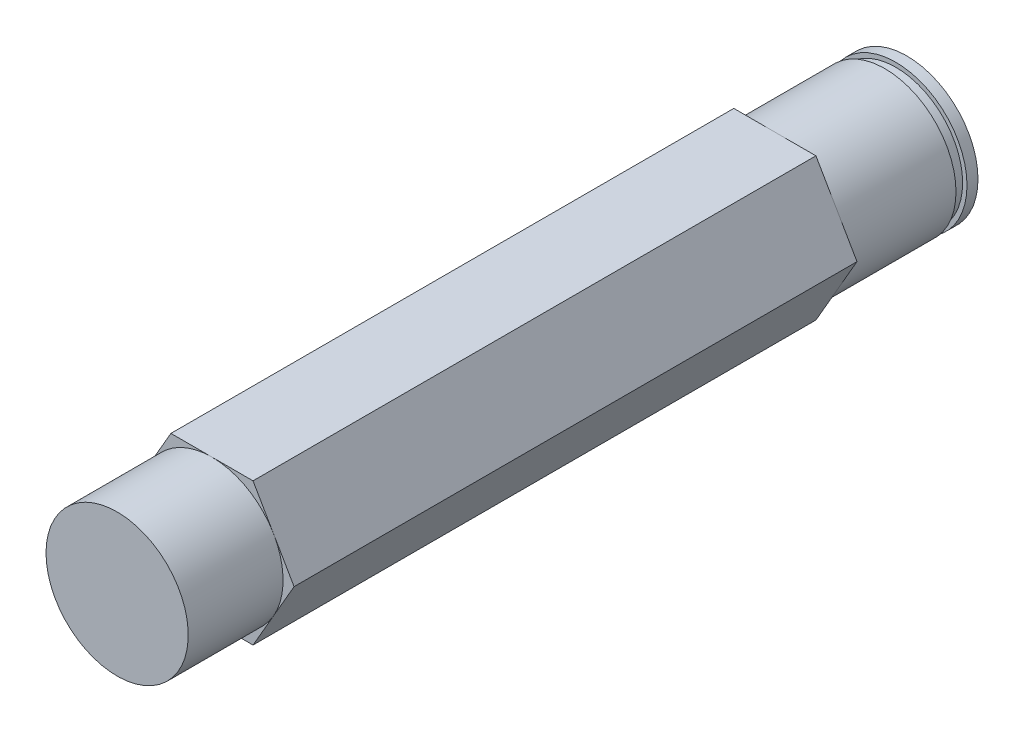
ISO-10303-21;
HEADER;
FILE_DESCRIPTION(('STEP AP214'),'2;1');
FILE_NAME('part.step','',(''),(''),'','','');
FILE_SCHEMA(('AUTOMOTIVE_DESIGN { 1 0 10303 214 1 1 1 1 }'));
ENDSEC;
DATA;
#1=APPLICATION_CONTEXT('core data for automotive mechanical design processes');
#2=APPLICATION_PROTOCOL_DEFINITION('international standard','automotive_design',2000,#1);
#3=PRODUCT_CONTEXT('',#1,'mechanical');
#4=PRODUCT('Part','Part','',(#3));
#5=PRODUCT_RELATED_PRODUCT_CATEGORY('part','',(#4));
#6=PRODUCT_DEFINITION_FORMATION('','',#4);
#7=PRODUCT_DEFINITION_CONTEXT('part definition',#1,'design');
#8=PRODUCT_DEFINITION('design','',#6,#7);
#9=PRODUCT_DEFINITION_SHAPE('','',#8);
#10=(LENGTH_UNIT() NAMED_UNIT(*) SI_UNIT(.MILLI.,.METRE.));
#11=(NAMED_UNIT(*) PLANE_ANGLE_UNIT() SI_UNIT($,.RADIAN.));
#12=(NAMED_UNIT(*) SI_UNIT($,.STERADIAN.) SOLID_ANGLE_UNIT());
#13=UNCERTAINTY_MEASURE_WITH_UNIT(LENGTH_MEASURE(1.E-05),#10,'distance_accuracy_value','');
#14=(GEOMETRIC_REPRESENTATION_CONTEXT(3) GLOBAL_UNCERTAINTY_ASSIGNED_CONTEXT((#13)) GLOBAL_UNIT_ASSIGNED_CONTEXT((#10,
#11,#12)) REPRESENTATION_CONTEXT('',''));
#15=CARTESIAN_POINT('',(0.,0.,0.));
#16=DIRECTION('',(0.,0.,1.));
#17=DIRECTION('',(1.,0.,0.));
#18=AXIS2_PLACEMENT_3D('',#15,#16,#17);
#19=CARTESIAN_POINT('',(0.,0.,-8.8392));
#20=DIRECTION('',(0.,0.,-1.));
#21=DIRECTION('',(-1.,0.,0.));
#22=AXIS2_PLACEMENT_3D('',#19,#20,#21);
#23=PLANE('',#22);
#24=CARTESIAN_POINT('',(0.,0.,-8.8392));
#25=DIRECTION('',(0.,0.,1.));
#26=DIRECTION('',(1.,0.,0.));
#27=AXIS2_PLACEMENT_3D('',#24,#25,#26);
#28=CIRCLE('',#27,4.7625);
#29=CARTESIAN_POINT('',(4.7625,0.,-8.8392));
#30=VERTEX_POINT('',#29);
#31=EDGE_CURVE('E20',#30,#30,#28,.T.);
#32=ORIENTED_EDGE('',*,*,#31,.F.);
#33=EDGE_LOOP('',(#32));
#34=FACE_BOUND('',#33,.T.);
#35=ADVANCED_FACE('F17',(#34),#23,.T.);
#36=CARTESIAN_POINT('',(0.,0.,-8.8392));
#37=DIRECTION('',(0.,0.,1.));
#38=DIRECTION('',(1.,0.,0.));
#39=AXIS2_PLACEMENT_3D('',#36,#37,#38);
#40=CYLINDRICAL_SURFACE('',#39,4.7625);
#41=ORIENTED_EDGE('',*,*,#31,.T.);
#42=EDGE_LOOP('',(#41));
#43=FACE_BOUND('',#42,.T.);
#44=CARTESIAN_POINT('',(0.,0.,-8.1026));
#45=DIRECTION('',(0.,0.,1.));
#46=DIRECTION('',(1.,0.,0.));
#47=AXIS2_PLACEMENT_3D('',#44,#45,#46);
#48=CIRCLE('',#47,4.7625);
#49=CARTESIAN_POINT('',(4.7625,0.,-8.1026));
#50=VERTEX_POINT('',#49);
#51=EDGE_CURVE('E145',#50,#50,#48,.F.);
#52=ORIENTED_EDGE('',*,*,#51,.T.);
#53=EDGE_LOOP('',(#52));
#54=FACE_BOUND('',#53,.T.);
#55=ADVANCED_FACE('F152',(#43,#54),#40,.T.);
#56=CARTESIAN_POINT('',(0.,0.,-8.1026));
#57=DIRECTION('',(0.,0.,-1.));
#58=DIRECTION('',(-1.,0.,0.));
#59=AXIS2_PLACEMENT_3D('',#56,#57,#58);
#60=PLANE('',#59);
#61=CARTESIAN_POINT('',(0.,0.,-8.1026));
#62=DIRECTION('',(0.,0.,1.));
#63=DIRECTION('',(1.,0.,0.));
#64=AXIS2_PLACEMENT_3D('',#61,#62,#63);
#65=CIRCLE('',#64,4.4704);
#66=CARTESIAN_POINT('',(4.4704,0.,-8.1026));
#67=VERTEX_POINT('',#66);
#68=EDGE_CURVE('E142',#67,#67,#65,.T.);
#69=ORIENTED_EDGE('',*,*,#68,.F.);
#70=EDGE_LOOP('',(#69));
#71=FACE_BOUND('',#70,.T.);
#72=ORIENTED_EDGE('',*,*,#51,.F.);
#73=EDGE_LOOP('',(#72));
#74=FACE_BOUND('',#73,.T.);
#75=ADVANCED_FACE('F159',(#71,#74),#60,.F.);
#76=CARTESIAN_POINT('',(0.,0.,-8.1026));
#77=DIRECTION('',(0.,0.,1.));
#78=DIRECTION('',(1.,0.,0.));
#79=AXIS2_PLACEMENT_3D('',#76,#77,#78);
#80=CYLINDRICAL_SURFACE('',#79,4.4704);
#81=ORIENTED_EDGE('',*,*,#68,.T.);
#82=EDGE_LOOP('',(#81));
#83=FACE_BOUND('',#82,.T.);
#84=CARTESIAN_POINT('',(0.,0.,-7.366));
#85=DIRECTION('',(0.,0.,1.));
#86=DIRECTION('',(1.,0.,0.));
#87=AXIS2_PLACEMENT_3D('',#84,#85,#86);
#88=CIRCLE('',#87,4.4704);
#89=CARTESIAN_POINT('',(4.4704,0.,-7.366));
#90=VERTEX_POINT('',#89);
#91=EDGE_CURVE('E137',#90,#90,#88,.F.);
#92=ORIENTED_EDGE('',*,*,#91,.T.);
#93=EDGE_LOOP('',(#92));
#94=FACE_BOUND('',#93,.T.);
#95=ADVANCED_FACE('F243',(#83,#94),#80,.T.);
#96=CARTESIAN_POINT('',(0.,0.,44.0436));
#97=DIRECTION('',(0.,0.,1.));
#98=DIRECTION('',(1.,0.,0.));
#99=AXIS2_PLACEMENT_3D('',#96,#97,#98);
#100=PLANE('',#99);
#101=CARTESIAN_POINT('',(0.,0.,44.0436));
#102=DIRECTION('',(0.,0.,-1.));
#103=DIRECTION('',(-1.,0.,0.));
#104=AXIS2_PLACEMENT_3D('',#101,#102,#103);
#105=CIRCLE('',#104,4.7625);
#106=CARTESIAN_POINT('',(-4.7625,0.,44.0436));
#107=VERTEX_POINT('',#106);
#108=EDGE_CURVE('E130',#107,#107,#105,.T.);
#109=ORIENTED_EDGE('',*,*,#108,.F.);
#110=EDGE_LOOP('',(#109));
#111=FACE_BOUND('',#110,.T.);
#112=ADVANCED_FACE('F240',(#111),#100,.T.);
#113=CARTESIAN_POINT('',(0.,0.,37.6936));
#114=DIRECTION('',(0.,0.,1.));
#115=DIRECTION('',(1.,0.,0.));
#116=AXIS2_PLACEMENT_3D('',#113,#114,#115);
#117=PLANE('',#116);
#118=DIRECTION('',(0.5,-0.866025403784439,0.));
#119=VECTOR('',#118,1.);
#120=CARTESIAN_POINT('',(5.49926131403118,0.,37.6936));
#121=LINE('',#120,#119);
#122=CARTESIAN_POINT('',(5.49926131403118,0.,37.6936));
#123=VERTEX_POINT('',#122);
#124=CARTESIAN_POINT('',(4.12444598552339,2.38125,37.6936));
#125=VERTEX_POINT('',#124);
#126=EDGE_CURVE('E114',#123,#125,#121,.F.);
#127=ORIENTED_EDGE('',*,*,#126,.T.);
#128=CARTESIAN_POINT('',(0.,0.,37.6936));
#129=DIRECTION('',(0.,0.,-1.));
#130=DIRECTION('',(-1.,0.,0.));
#131=AXIS2_PLACEMENT_3D('',#128,#129,#130);
#132=CIRCLE('',#131,4.7625);
#133=CARTESIAN_POINT('',(4.12444598552339,-2.38125,37.6936));
#134=VERTEX_POINT('',#133);
#135=EDGE_CURVE('E107',#134,#125,#132,.F.);
#136=ORIENTED_EDGE('',*,*,#135,.F.);
#137=DIRECTION('',(-0.5,-0.866025403784439,0.));
#138=VECTOR('',#137,1.);
#139=CARTESIAN_POINT('',(2.74963065701559,-4.7625,37.6936));
#140=LINE('',#139,#138);
#141=EDGE_CURVE('E104',#134,#123,#140,.F.);
#142=ORIENTED_EDGE('',*,*,#141,.T.);
#143=EDGE_LOOP('',(#127,#136,#142));
#144=FACE_BOUND('',#143,.T.);
#145=ADVANCED_FACE('F115',(#144),#117,.T.);
#146=CARTESIAN_POINT('',(0.,0.,37.6936));
#147=DIRECTION('',(0.,0.,1.));
#148=DIRECTION('',(1.,0.,0.));
#149=AXIS2_PLACEMENT_3D('',#146,#147,#148);
#150=PLANE('',#149);
#151=DIRECTION('',(-1.,0.,0.));
#152=VECTOR('',#151,1.);
#153=CARTESIAN_POINT('',(-2.7496306570156,-4.7625,37.6936));
#154=LINE('',#153,#152);
#155=CARTESIAN_POINT('',(0.,-4.7625,37.6936));
#156=VERTEX_POINT('',#155);
#157=CARTESIAN_POINT('',(2.74963065701559,-4.7625,37.6936));
#158=VERTEX_POINT('',#157);
#159=EDGE_CURVE('E279',#156,#158,#154,.F.);
#160=ORIENTED_EDGE('',*,*,#159,.T.);
#161=DIRECTION('',(-0.5,-0.866025403784439,0.));
#162=VECTOR('',#161,1.);
#163=CARTESIAN_POINT('',(2.74963065701559,-4.7625,37.6936));
#164=LINE('',#163,#162);
#165=EDGE_CURVE('E144',#158,#134,#164,.F.);
#166=ORIENTED_EDGE('',*,*,#165,.T.);
#167=CARTESIAN_POINT('',(0.,0.,37.6936));
#168=DIRECTION('',(0.,0.,-1.));
#169=DIRECTION('',(-1.,0.,0.));
#170=AXIS2_PLACEMENT_3D('',#167,#168,#169);
#171=CIRCLE('',#170,4.7625);
#172=EDGE_CURVE('E110',#156,#134,#171,.F.);
#173=ORIENTED_EDGE('',*,*,#172,.F.);
#174=EDGE_LOOP('',(#160,#166,#173));
#175=FACE_BOUND('',#174,.T.);
#176=ADVANCED_FACE('F233',(#175),#150,.T.);
#177=CARTESIAN_POINT('',(2.74963065701559,-4.7625,37.6936));
#178=DIRECTION('',(-0.866025403784439,0.5,0.));
#179=DIRECTION('',(-0.5,-0.866025403784439,0.));
#180=AXIS2_PLACEMENT_3D('',#177,#178,#179);
#181=PLANE('',#180);
#182=DIRECTION('',(0.499999999999999,0.866025403784439,0.));
#183=VECTOR('',#182,1.);
#184=CARTESIAN_POINT('',(4.12444598552339,-2.38125,0.));
#185=LINE('',#184,#183);
#186=CARTESIAN_POINT('',(4.12444598552339,-2.38125,0.));
#187=VERTEX_POINT('',#186);
#188=CARTESIAN_POINT('',(5.49926131403118,0.,0.));
#189=VERTEX_POINT('',#188);
#190=EDGE_CURVE('E140',#187,#189,#185,.T.);
#191=ORIENTED_EDGE('',*,*,#190,.T.);
#192=DIRECTION('',(0.,0.,1.));
#193=VECTOR('',#192,1.);
#194=CARTESIAN_POINT('',(5.49926131403118,0.,37.6936));
#195=LINE('',#194,#193);
#196=EDGE_CURVE('E119',#189,#123,#195,.T.);
#197=ORIENTED_EDGE('',*,*,#196,.T.);
#198=ORIENTED_EDGE('',*,*,#141,.F.);
#199=ORIENTED_EDGE('',*,*,#165,.F.);
#200=DIRECTION('',(0.,0.,1.));
#201=VECTOR('',#200,1.);
#202=CARTESIAN_POINT('',(2.74963065701559,-4.7625,37.6936));
#203=LINE('',#202,#201);
#204=CARTESIAN_POINT('',(2.74963065701559,-4.7625,0.));
#205=VERTEX_POINT('',#204);
#206=EDGE_CURVE('E283',#158,#205,#203,.F.);
#207=ORIENTED_EDGE('',*,*,#206,.T.);
#208=DIRECTION('',(0.5,0.866025403784439,0.));
#209=VECTOR('',#208,1.);
#210=CARTESIAN_POINT('',(2.74963065701559,-4.7625,0.));
#211=LINE('',#210,#209);
#212=EDGE_CURVE('E141',#205,#187,#211,.T.);
#213=ORIENTED_EDGE('',*,*,#212,.T.);
#214=EDGE_LOOP('',(#191,#197,#198,#199,#207,#213));
#215=FACE_BOUND('',#214,.T.);
#216=ADVANCED_FACE('F229',(#215),#181,.F.);
#217=CARTESIAN_POINT('',(0.,0.,0.));
#218=DIRECTION('',(0.,0.,1.));
#219=DIRECTION('',(1.,0.,0.));
#220=AXIS2_PLACEMENT_3D('',#217,#218,#219);
#221=PLANE('',#220);
#222=CARTESIAN_POINT('',(0.,0.,0.));
#223=DIRECTION('',(0.,0.,1.));
#224=DIRECTION('',(1.,0.,0.));
#225=AXIS2_PLACEMENT_3D('',#222,#223,#224);
#226=CIRCLE('',#225,4.7625);
#227=CARTESIAN_POINT('',(0.,-4.7625,0.));
#228=VERTEX_POINT('',#227);
#229=EDGE_CURVE('E268',#187,#228,#226,.F.);
#230=ORIENTED_EDGE('',*,*,#229,.F.);
#231=ORIENTED_EDGE('',*,*,#212,.F.);
#232=DIRECTION('',(-1.,0.,0.));
#233=VECTOR('',#232,1.);
#234=CARTESIAN_POINT('',(-2.7496306570156,-4.7625,0.));
#235=LINE('',#234,#233);
#236=EDGE_CURVE('E316',#205,#228,#235,.T.);
#237=ORIENTED_EDGE('',*,*,#236,.T.);
#238=EDGE_LOOP('',(#230,#231,#237));
#239=FACE_BOUND('',#238,.T.);
#240=ADVANCED_FACE('F225',(#239),#221,.F.);
#241=CARTESIAN_POINT('',(0.,0.,-7.366));
#242=DIRECTION('',(0.,0.,1.));
#243=DIRECTION('',(1.,0.,0.));
#244=AXIS2_PLACEMENT_3D('',#241,#242,#243);
#245=PLANE('',#244);
#246=ORIENTED_EDGE('',*,*,#91,.F.);
#247=EDGE_LOOP('',(#246));
#248=FACE_BOUND('',#247,.T.);
#249=CARTESIAN_POINT('',(0.,0.,-7.366));
#250=DIRECTION('',(0.,0.,1.));
#251=DIRECTION('',(1.,0.,0.));
#252=AXIS2_PLACEMENT_3D('',#249,#250,#251);
#253=CIRCLE('',#252,4.7625);
#254=CARTESIAN_POINT('',(4.7625,0.,-7.366));
#255=VERTEX_POINT('',#254);
#256=EDGE_CURVE('E259',#255,#255,#253,.T.);
#257=ORIENTED_EDGE('',*,*,#256,.F.);
#258=EDGE_LOOP('',(#257));
#259=FACE_BOUND('',#258,.T.);
#260=ADVANCED_FACE('F221',(#248,#259),#245,.F.);
#261=CARTESIAN_POINT('',(0.,0.,0.));
#262=DIRECTION('',(0.,0.,1.));
#263=DIRECTION('',(1.,0.,0.));
#264=AXIS2_PLACEMENT_3D('',#261,#262,#263);
#265=PLANE('',#264);
#266=ORIENTED_EDGE('',*,*,#190,.F.);
#267=CARTESIAN_POINT('',(0.,0.,0.));
#268=DIRECTION('',(0.,0.,1.));
#269=DIRECTION('',(1.,0.,0.));
#270=AXIS2_PLACEMENT_3D('',#267,#268,#269);
#271=CIRCLE('',#270,4.7625);
#272=CARTESIAN_POINT('',(4.12444598552339,2.38125,0.));
#273=VERTEX_POINT('',#272);
#274=EDGE_CURVE('E265',#273,#187,#271,.F.);
#275=ORIENTED_EDGE('',*,*,#274,.F.);
#276=DIRECTION('',(0.5,-0.866025403784439,0.));
#277=VECTOR('',#276,1.);
#278=CARTESIAN_POINT('',(5.49926131403118,0.,0.));
#279=LINE('',#278,#277);
#280=EDGE_CURVE('E118',#273,#189,#279,.T.);
#281=ORIENTED_EDGE('',*,*,#280,.T.);
#282=EDGE_LOOP('',(#266,#275,#281));
#283=FACE_BOUND('',#282,.T.);
#284=ADVANCED_FACE('F218',(#283),#265,.F.);
#285=CARTESIAN_POINT('',(5.49926131403118,0.,37.6936));
#286=DIRECTION('',(-0.866025403784439,-0.5,0.));
#287=DIRECTION('',(0.5,-0.866025403784439,0.));
#288=AXIS2_PLACEMENT_3D('',#285,#286,#287);
#289=PLANE('',#288);
#290=DIRECTION('',(-0.5,0.866025403784439,0.));
#291=VECTOR('',#290,1.);
#292=CARTESIAN_POINT('',(4.12444598552339,2.38125,0.));
#293=LINE('',#292,#291);
#294=CARTESIAN_POINT('',(2.74963065701559,4.7625,0.));
#295=VERTEX_POINT('',#294);
#296=EDGE_CURVE('E125',#273,#295,#293,.T.);
#297=ORIENTED_EDGE('',*,*,#296,.T.);
#298=DIRECTION('',(0.,0.,-1.));
#299=VECTOR('',#298,1.);
#300=CARTESIAN_POINT('',(2.74963065701559,4.7625,37.6936));
#301=LINE('',#300,#299);
#302=CARTESIAN_POINT('',(2.74963065701559,4.7625,37.6936));
#303=VERTEX_POINT('',#302);
#304=EDGE_CURVE('E124',#295,#303,#301,.F.);
#305=ORIENTED_EDGE('',*,*,#304,.T.);
#306=DIRECTION('',(-0.5,0.866025403784439,0.));
#307=VECTOR('',#306,1.);
#308=CARTESIAN_POINT('',(4.12444598552339,2.38125,37.6936));
#309=LINE('',#308,#307);
#310=EDGE_CURVE('E90',#125,#303,#309,.T.);
#311=ORIENTED_EDGE('',*,*,#310,.F.);
#312=ORIENTED_EDGE('',*,*,#126,.F.);
#313=ORIENTED_EDGE('',*,*,#196,.F.);
#314=ORIENTED_EDGE('',*,*,#280,.F.);
#315=EDGE_LOOP('',(#297,#305,#311,#312,#313,#314));
#316=FACE_BOUND('',#315,.T.);
#317=ADVANCED_FACE('F123',(#316),#289,.F.);
#318=CARTESIAN_POINT('',(0.,0.,37.6936));
#319=DIRECTION('',(0.,0.,1.));
#320=DIRECTION('',(1.,0.,0.));
#321=AXIS2_PLACEMENT_3D('',#318,#319,#320);
#322=PLANE('',#321);
#323=ORIENTED_EDGE('',*,*,#310,.T.);
#324=DIRECTION('',(1.,0.,0.));
#325=VECTOR('',#324,1.);
#326=CARTESIAN_POINT('',(2.74963065701559,4.7625,37.6936));
#327=LINE('',#326,#325);
#328=CARTESIAN_POINT('',(0.,4.7625,37.6936));
#329=VERTEX_POINT('',#328);
#330=EDGE_CURVE('E128',#303,#329,#327,.F.);
#331=ORIENTED_EDGE('',*,*,#330,.T.);
#332=CARTESIAN_POINT('',(0.,0.,37.6936));
#333=DIRECTION('',(0.,0.,-1.));
#334=DIRECTION('',(-1.,0.,0.));
#335=AXIS2_PLACEMENT_3D('',#332,#333,#334);
#336=CIRCLE('',#335,4.7625);
#337=EDGE_CURVE('E83',#125,#329,#336,.F.);
#338=ORIENTED_EDGE('',*,*,#337,.F.);
#339=EDGE_LOOP('',(#323,#331,#338));
#340=FACE_BOUND('',#339,.T.);
#341=ADVANCED_FACE('F127',(#340),#322,.T.);
#342=CARTESIAN_POINT('',(0.,0.,0.));
#343=DIRECTION('',(0.,0.,1.));
#344=DIRECTION('',(1.,0.,0.));
#345=AXIS2_PLACEMENT_3D('',#342,#343,#344);
#346=PLANE('',#345);
#347=CARTESIAN_POINT('',(0.,0.,0.));
#348=DIRECTION('',(0.,0.,1.));
#349=DIRECTION('',(1.,0.,0.));
#350=AXIS2_PLACEMENT_3D('',#347,#348,#349);
#351=CIRCLE('',#350,4.7625);
#352=CARTESIAN_POINT('',(0.,4.7625,0.));
#353=VERTEX_POINT('',#352);
#354=EDGE_CURVE('E261',#353,#273,#351,.F.);
#355=ORIENTED_EDGE('',*,*,#354,.F.);
#356=DIRECTION('',(1.,0.,0.));
#357=VECTOR('',#356,1.);
#358=CARTESIAN_POINT('',(2.74963065701559,4.7625,0.));
#359=LINE('',#358,#357);
#360=EDGE_CURVE('E298',#353,#295,#359,.T.);
#361=ORIENTED_EDGE('',*,*,#360,.T.);
#362=ORIENTED_EDGE('',*,*,#296,.F.);
#363=EDGE_LOOP('',(#355,#361,#362));
#364=FACE_BOUND('',#363,.T.);
#365=ADVANCED_FACE('F209',(#364),#346,.F.);
#366=CARTESIAN_POINT('',(0.,0.,44.0436));
#367=DIRECTION('',(0.,0.,-1.));
#368=DIRECTION('',(-1.,0.,0.));
#369=AXIS2_PLACEMENT_3D('',#366,#367,#368);
#370=CYLINDRICAL_SURFACE('',#369,4.7625);
#371=ORIENTED_EDGE('',*,*,#108,.T.);
#372=EDGE_LOOP('',(#371));
#373=FACE_BOUND('',#372,.T.);
#374=ORIENTED_EDGE('',*,*,#172,.T.);
#375=ORIENTED_EDGE('',*,*,#135,.T.);
#376=ORIENTED_EDGE('',*,*,#337,.T.);
#377=CARTESIAN_POINT('',(0.,0.,37.6936));
#378=DIRECTION('',(0.,0.,-1.));
#379=DIRECTION('',(-1.,0.,0.));
#380=AXIS2_PLACEMENT_3D('',#377,#378,#379);
#381=CIRCLE('',#380,4.7625);
#382=CARTESIAN_POINT('',(-4.12444598552339,2.38125,37.6936));
#383=VERTEX_POINT('',#382);
#384=EDGE_CURVE('E349',#383,#329,#381,.T.);
#385=ORIENTED_EDGE('',*,*,#384,.F.);
#386=CARTESIAN_POINT('',(0.,0.,37.6936));
#387=DIRECTION('',(0.,0.,-1.));
#388=DIRECTION('',(-1.,0.,0.));
#389=AXIS2_PLACEMENT_3D('',#386,#387,#388);
#390=CIRCLE('',#389,4.7625);
#391=CARTESIAN_POINT('',(-4.12444598552339,-2.38125,37.6936));
#392=VERTEX_POINT('',#391);
#393=EDGE_CURVE('E346',#392,#383,#390,.T.);
#394=ORIENTED_EDGE('',*,*,#393,.F.);
#395=CARTESIAN_POINT('',(0.,0.,37.6936));
#396=DIRECTION('',(0.,0.,-1.));
#397=DIRECTION('',(-1.,0.,0.));
#398=AXIS2_PLACEMENT_3D('',#395,#396,#397);
#399=CIRCLE('',#398,4.7625);
#400=EDGE_CURVE('E112',#156,#392,#399,.T.);
#401=ORIENTED_EDGE('',*,*,#400,.F.);
#402=EDGE_LOOP('',(#374,#375,#376,#385,#394,#401));
#403=FACE_BOUND('',#402,.T.);
#404=ADVANCED_FACE('F108',(#373,#403),#370,.T.);
#405=CARTESIAN_POINT('',(0.,0.,37.6936));
#406=DIRECTION('',(0.,0.,1.));
#407=DIRECTION('',(1.,0.,0.));
#408=AXIS2_PLACEMENT_3D('',#405,#406,#407);
#409=PLANE('',#408);
#410=DIRECTION('',(-0.5,0.866025403784439,0.));
#411=VECTOR('',#410,1.);
#412=CARTESIAN_POINT('',(-5.49926131403119,0.,37.6936));
#413=LINE('',#412,#411);
#414=CARTESIAN_POINT('',(-2.7496306570156,-4.7625,37.6936));
#415=VERTEX_POINT('',#414);
#416=EDGE_CURVE('E291',#392,#415,#413,.F.);
#417=ORIENTED_EDGE('',*,*,#416,.T.);
#418=DIRECTION('',(-1.,0.,0.));
#419=VECTOR('',#418,1.);
#420=CARTESIAN_POINT('',(-2.7496306570156,-4.7625,37.6936));
#421=LINE('',#420,#419);
#422=EDGE_CURVE('E275',#415,#156,#421,.F.);
#423=ORIENTED_EDGE('',*,*,#422,.T.);
#424=ORIENTED_EDGE('',*,*,#400,.T.);
#425=EDGE_LOOP('',(#417,#423,#424));
#426=FACE_BOUND('',#425,.T.);
#427=ADVANCED_FACE('F202',(#426),#409,.T.);
#428=CARTESIAN_POINT('',(-2.7496306570156,-4.7625,37.6936));
#429=DIRECTION('',(0.,1.,0.));
#430=DIRECTION('',(-1.,0.,0.));
#431=AXIS2_PLACEMENT_3D('',#428,#429,#430);
#432=PLANE('',#431);
#433=ORIENTED_EDGE('',*,*,#236,.F.);
#434=ORIENTED_EDGE('',*,*,#206,.F.);
#435=ORIENTED_EDGE('',*,*,#159,.F.);
#436=ORIENTED_EDGE('',*,*,#422,.F.);
#437=DIRECTION('',(0.,0.,1.));
#438=VECTOR('',#437,1.);
#439=CARTESIAN_POINT('',(-2.7496306570156,-4.7625,37.6936));
#440=LINE('',#439,#438);
#441=CARTESIAN_POINT('',(-2.7496306570156,-4.7625,0.));
#442=VERTEX_POINT('',#441);
#443=EDGE_CURVE('E293',#415,#442,#440,.F.);
#444=ORIENTED_EDGE('',*,*,#443,.T.);
#445=DIRECTION('',(1.,0.,0.));
#446=VECTOR('',#445,1.);
#447=CARTESIAN_POINT('',(0.,-4.7625,0.));
#448=LINE('',#447,#446);
#449=EDGE_CURVE('E274',#442,#228,#448,.T.);
#450=ORIENTED_EDGE('',*,*,#449,.T.);
#451=EDGE_LOOP('',(#433,#434,#435,#436,#444,#450));
#452=FACE_BOUND('',#451,.T.);
#453=ADVANCED_FACE('F198',(#452),#432,.F.);
#454=CARTESIAN_POINT('',(0.,0.,0.));
#455=DIRECTION('',(0.,0.,1.));
#456=DIRECTION('',(1.,0.,0.));
#457=AXIS2_PLACEMENT_3D('',#454,#455,#456);
#458=PLANE('',#457);
#459=CARTESIAN_POINT('',(0.,0.,0.));
#460=DIRECTION('',(0.,0.,1.));
#461=DIRECTION('',(1.,0.,0.));
#462=AXIS2_PLACEMENT_3D('',#459,#460,#461);
#463=CIRCLE('',#462,4.7625);
#464=CARTESIAN_POINT('',(-4.12444598552339,-2.38125,0.));
#465=VERTEX_POINT('',#464);
#466=EDGE_CURVE('E262',#228,#465,#463,.F.);
#467=ORIENTED_EDGE('',*,*,#466,.F.);
#468=ORIENTED_EDGE('',*,*,#449,.F.);
#469=DIRECTION('',(-0.5,0.866025403784439,0.));
#470=VECTOR('',#469,1.);
#471=CARTESIAN_POINT('',(-5.49926131403119,0.,0.));
#472=LINE('',#471,#470);
#473=EDGE_CURVE('E366',#442,#465,#472,.T.);
#474=ORIENTED_EDGE('',*,*,#473,.T.);
#475=EDGE_LOOP('',(#467,#468,#474));
#476=FACE_BOUND('',#475,.T.);
#477=ADVANCED_FACE('F194',(#476),#458,.F.);
#478=CARTESIAN_POINT('',(0.,0.,-7.366));
#479=DIRECTION('',(0.,0.,1.));
#480=DIRECTION('',(1.,0.,0.));
#481=AXIS2_PLACEMENT_3D('',#478,#479,#480);
#482=CYLINDRICAL_SURFACE('',#481,4.7625);
#483=ORIENTED_EDGE('',*,*,#466,.T.);
#484=CARTESIAN_POINT('',(0.,0.,0.));
#485=DIRECTION('',(0.,0.,1.));
#486=DIRECTION('',(1.,0.,0.));
#487=AXIS2_PLACEMENT_3D('',#484,#485,#486);
#488=CIRCLE('',#487,4.7625);
#489=CARTESIAN_POINT('',(-4.12444598552339,2.38125,0.));
#490=VERTEX_POINT('',#489);
#491=EDGE_CURVE('E343',#465,#490,#488,.F.);
#492=ORIENTED_EDGE('',*,*,#491,.T.);
#493=CARTESIAN_POINT('',(0.,0.,0.));
#494=DIRECTION('',(0.,0.,1.));
#495=DIRECTION('',(1.,0.,0.));
#496=AXIS2_PLACEMENT_3D('',#493,#494,#495);
#497=CIRCLE('',#496,4.7625);
#498=EDGE_CURVE('E34',#490,#353,#497,.F.);
#499=ORIENTED_EDGE('',*,*,#498,.T.);
#500=ORIENTED_EDGE('',*,*,#354,.T.);
#501=ORIENTED_EDGE('',*,*,#274,.T.);
#502=ORIENTED_EDGE('',*,*,#229,.T.);
#503=EDGE_LOOP('',(#483,#492,#499,#500,#501,#502));
#504=FACE_BOUND('',#503,.T.);
#505=ORIENTED_EDGE('',*,*,#256,.T.);
#506=EDGE_LOOP('',(#505));
#507=FACE_BOUND('',#506,.T.);
#508=ADVANCED_FACE('F190',(#504,#507),#482,.T.);
#509=CARTESIAN_POINT('',(2.74963065701559,4.7625,37.6936));
#510=DIRECTION('',(0.,-1.,0.));
#511=DIRECTION('',(0.,0.,-1.));
#512=AXIS2_PLACEMENT_3D('',#509,#510,#511);
#513=PLANE('',#512);
#514=DIRECTION('',(1.,0.,0.));
#515=VECTOR('',#514,1.);
#516=CARTESIAN_POINT('',(0.,4.7625,0.));
#517=LINE('',#516,#515);
#518=CARTESIAN_POINT('',(-2.74963065701559,4.7625,0.));
#519=VERTEX_POINT('',#518);
#520=EDGE_CURVE('E342',#353,#519,#517,.F.);
#521=ORIENTED_EDGE('',*,*,#520,.T.);
#522=DIRECTION('',(0.,0.,1.));
#523=VECTOR('',#522,1.);
#524=CARTESIAN_POINT('',(-2.74963065701559,4.7625,37.6936));
#525=LINE('',#524,#523);
#526=CARTESIAN_POINT('',(-2.74963065701559,4.7625,37.6936));
#527=VERTEX_POINT('',#526);
#528=EDGE_CURVE('E375',#519,#527,#525,.T.);
#529=ORIENTED_EDGE('',*,*,#528,.T.);
#530=DIRECTION('',(1.,0.,0.));
#531=VECTOR('',#530,1.);
#532=CARTESIAN_POINT('',(0.,4.7625,37.6936));
#533=LINE('',#532,#531);
#534=EDGE_CURVE('E348',#329,#527,#533,.F.);
#535=ORIENTED_EDGE('',*,*,#534,.F.);
#536=ORIENTED_EDGE('',*,*,#330,.F.);
#537=ORIENTED_EDGE('',*,*,#304,.F.);
#538=ORIENTED_EDGE('',*,*,#360,.F.);
#539=EDGE_LOOP('',(#521,#529,#535,#536,#537,#538));
#540=FACE_BOUND('',#539,.T.);
#541=ADVANCED_FACE('F186',(#540),#513,.F.);
#542=CARTESIAN_POINT('',(0.,0.,37.6936));
#543=DIRECTION('',(0.,0.,1.));
#544=DIRECTION('',(1.,0.,0.));
#545=AXIS2_PLACEMENT_3D('',#542,#543,#544);
#546=PLANE('',#545);
#547=ORIENTED_EDGE('',*,*,#534,.T.);
#548=DIRECTION('',(0.5,0.866025403784439,0.));
#549=VECTOR('',#548,1.);
#550=CARTESIAN_POINT('',(-2.74963065701559,4.7625,37.6936));
#551=LINE('',#550,#549);
#552=EDGE_CURVE('E390',#527,#383,#551,.F.);
#553=ORIENTED_EDGE('',*,*,#552,.T.);
#554=ORIENTED_EDGE('',*,*,#384,.T.);
#555=EDGE_LOOP('',(#547,#553,#554));
#556=FACE_BOUND('',#555,.T.);
#557=ADVANCED_FACE('F182',(#556),#546,.T.);
#558=CARTESIAN_POINT('',(0.,0.,37.6936));
#559=DIRECTION('',(0.,0.,1.));
#560=DIRECTION('',(1.,0.,0.));
#561=AXIS2_PLACEMENT_3D('',#558,#559,#560);
#562=PLANE('',#561);
#563=DIRECTION('',(-0.5,0.866025403784439,0.));
#564=VECTOR('',#563,1.);
#565=CARTESIAN_POINT('',(-5.49926131403119,0.,37.6936));
#566=LINE('',#565,#564);
#567=CARTESIAN_POINT('',(-5.49926131403119,0.,37.6936));
#568=VERTEX_POINT('',#567);
#569=EDGE_CURVE('E294',#568,#392,#566,.F.);
#570=ORIENTED_EDGE('',*,*,#569,.T.);
#571=ORIENTED_EDGE('',*,*,#393,.T.);
#572=DIRECTION('',(0.5,0.866025403784439,0.));
#573=VECTOR('',#572,1.);
#574=CARTESIAN_POINT('',(-2.74963065701559,4.7625,37.6936));
#575=LINE('',#574,#573);
#576=EDGE_CURVE('E379',#383,#568,#575,.F.);
#577=ORIENTED_EDGE('',*,*,#576,.T.);
#578=EDGE_LOOP('',(#570,#571,#577));
#579=FACE_BOUND('',#578,.T.);
#580=ADVANCED_FACE('F178',(#579),#562,.T.);
#581=CARTESIAN_POINT('',(-5.49926131403119,0.,37.6936));
#582=DIRECTION('',(0.866025403784439,0.5,0.));
#583=DIRECTION('',(-0.5,0.866025403784439,0.));
#584=AXIS2_PLACEMENT_3D('',#581,#582,#583);
#585=PLANE('',#584);
#586=ORIENTED_EDGE('',*,*,#473,.F.);
#587=ORIENTED_EDGE('',*,*,#443,.F.);
#588=ORIENTED_EDGE('',*,*,#416,.F.);
#589=ORIENTED_EDGE('',*,*,#569,.F.);
#590=DIRECTION('',(0.,0.,1.));
#591=VECTOR('',#590,1.);
#592=CARTESIAN_POINT('',(-5.49926131403119,0.,37.6936));
#593=LINE('',#592,#591);
#594=CARTESIAN_POINT('',(-5.49926131403119,0.,0.));
#595=VERTEX_POINT('',#594);
#596=EDGE_CURVE('E377',#568,#595,#593,.F.);
#597=ORIENTED_EDGE('',*,*,#596,.T.);
#598=DIRECTION('',(0.5,-0.866025403784439,0.));
#599=VECTOR('',#598,1.);
#600=CARTESIAN_POINT('',(-5.49926131403119,0.,0.));
#601=LINE('',#600,#599);
#602=EDGE_CURVE('E345',#595,#465,#601,.T.);
#603=ORIENTED_EDGE('',*,*,#602,.T.);
#604=EDGE_LOOP('',(#586,#587,#588,#589,#597,#603));
#605=FACE_BOUND('',#604,.T.);
#606=ADVANCED_FACE('F174',(#605),#585,.F.);
#607=CARTESIAN_POINT('',(0.,0.,0.));
#608=DIRECTION('',(0.,0.,1.));
#609=DIRECTION('',(1.,0.,0.));
#610=AXIS2_PLACEMENT_3D('',#607,#608,#609);
#611=PLANE('',#610);
#612=ORIENTED_EDGE('',*,*,#491,.F.);
#613=ORIENTED_EDGE('',*,*,#602,.F.);
#614=DIRECTION('',(0.5,0.866025403784439,0.));
#615=VECTOR('',#614,1.);
#616=CARTESIAN_POINT('',(-2.74963065701559,4.7625,0.));
#617=LINE('',#616,#615);
#618=EDGE_CURVE('E26',#595,#490,#617,.T.);
#619=ORIENTED_EDGE('',*,*,#618,.T.);
#620=EDGE_LOOP('',(#612,#613,#619));
#621=FACE_BOUND('',#620,.T.);
#622=ADVANCED_FACE('F168',(#621),#611,.F.);
#623=CARTESIAN_POINT('',(0.,0.,0.));
#624=DIRECTION('',(0.,0.,1.));
#625=DIRECTION('',(1.,0.,0.));
#626=AXIS2_PLACEMENT_3D('',#623,#624,#625);
#627=PLANE('',#626);
#628=ORIENTED_EDGE('',*,*,#498,.F.);
#629=DIRECTION('',(0.5,0.866025403784439,0.));
#630=VECTOR('',#629,1.);
#631=CARTESIAN_POINT('',(-2.74963065701559,4.7625,0.));
#632=LINE('',#631,#630);
#633=EDGE_CURVE('E11',#490,#519,#632,.T.);
#634=ORIENTED_EDGE('',*,*,#633,.T.);
#635=ORIENTED_EDGE('',*,*,#520,.F.);
#636=EDGE_LOOP('',(#628,#634,#635));
#637=FACE_BOUND('',#636,.T.);
#638=ADVANCED_FACE('F162',(#637),#627,.F.);
#639=CARTESIAN_POINT('',(-2.74963065701559,4.7625,37.6936));
#640=DIRECTION('',(0.866025403784439,-0.5,0.));
#641=DIRECTION('',(0.5,0.866025403784439,0.));
#642=AXIS2_PLACEMENT_3D('',#639,#640,#641);
#643=PLANE('',#642);
#644=ORIENTED_EDGE('',*,*,#618,.F.);
#645=ORIENTED_EDGE('',*,*,#596,.F.);
#646=ORIENTED_EDGE('',*,*,#576,.F.);
#647=ORIENTED_EDGE('',*,*,#552,.F.);
#648=ORIENTED_EDGE('',*,*,#528,.F.);
#649=ORIENTED_EDGE('',*,*,#633,.F.);
#650=EDGE_LOOP('',(#644,#645,#646,#647,#648,#649));
#651=FACE_BOUND('',#650,.T.);
#652=ADVANCED_FACE('F160',(#651),#643,.F.);
#653=CLOSED_SHELL('',(#35,#55,#75,#95,#112,#145,#176,#216,#240,#260,#284,#317,#341,#365,#404,
#427,#453,#477,#508,#541,#557,#580,#606,#622,#638,#652));
#654=MANIFOLD_SOLID_BREP('B1',#653);
#655=ADVANCED_BREP_SHAPE_REPRESENTATION('',(#18,#654),#14);
#656=SHAPE_DEFINITION_REPRESENTATION(#9,#655);
ENDSEC;
END-ISO-10303-21;
